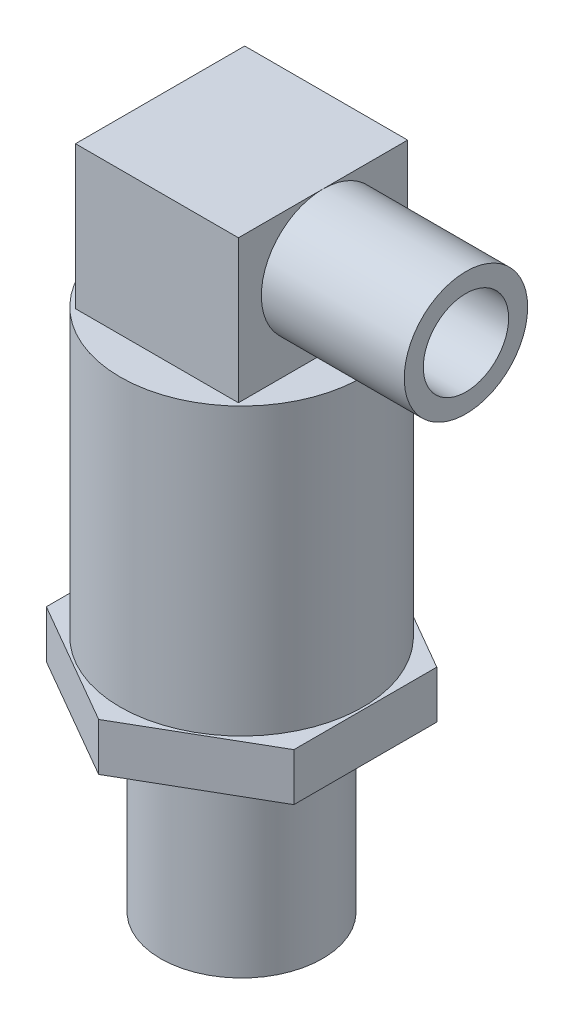
ISO-10303-21;
HEADER;
FILE_DESCRIPTION(('STEP AP214'),'2;1');
FILE_NAME('part.step','',(''),(''),'','','');
FILE_SCHEMA(('AUTOMOTIVE_DESIGN { 1 0 10303 214 1 1 1 1 }'));
ENDSEC;
DATA;
#1=APPLICATION_CONTEXT('core data for automotive mechanical design processes');
#2=APPLICATION_PROTOCOL_DEFINITION('international standard','automotive_design',2000,#1);
#3=PRODUCT_CONTEXT('',#1,'mechanical');
#4=PRODUCT('Part','Part','',(#3));
#5=PRODUCT_RELATED_PRODUCT_CATEGORY('part','',(#4));
#6=PRODUCT_DEFINITION_FORMATION('','',#4);
#7=PRODUCT_DEFINITION_CONTEXT('part definition',#1,'design');
#8=PRODUCT_DEFINITION('design','',#6,#7);
#9=PRODUCT_DEFINITION_SHAPE('','',#8);
#10=(LENGTH_UNIT() NAMED_UNIT(*) SI_UNIT(.MILLI.,.METRE.));
#11=(NAMED_UNIT(*) PLANE_ANGLE_UNIT() SI_UNIT($,.RADIAN.));
#12=(NAMED_UNIT(*) SI_UNIT($,.STERADIAN.) SOLID_ANGLE_UNIT());
#13=UNCERTAINTY_MEASURE_WITH_UNIT(LENGTH_MEASURE(1.E-05),#10,'distance_accuracy_value','');
#14=(GEOMETRIC_REPRESENTATION_CONTEXT(3) GLOBAL_UNCERTAINTY_ASSIGNED_CONTEXT((#13)) GLOBAL_UNIT_ASSIGNED_CONTEXT((#10,
#11,#12)) REPRESENTATION_CONTEXT('',''));
#15=CARTESIAN_POINT('',(0.,0.,0.));
#16=DIRECTION('',(0.,0.,1.));
#17=DIRECTION('',(1.,0.,0.));
#18=AXIS2_PLACEMENT_3D('',#15,#16,#17);
#19=CARTESIAN_POINT('',(0.,-20.,0.));
#20=DIRECTION('',(0.,1.,0.));
#21=DIRECTION('',(0.,0.,1.));
#22=AXIS2_PLACEMENT_3D('',#19,#20,#21);
#23=CYLINDRICAL_SURFACE('',#22,8.5);
#24=CARTESIAN_POINT('',(0.,-20.,0.));
#25=DIRECTION('',(0.,1.,0.));
#26=DIRECTION('',(0.,0.,1.));
#27=AXIS2_PLACEMENT_3D('',#24,#25,#26);
#28=CIRCLE('',#27,8.5);
#29=CARTESIAN_POINT('',(0.,-20.,8.5));
#30=VERTEX_POINT('',#29);
#31=EDGE_CURVE('E48',#30,#30,#28,.T.);
#32=ORIENTED_EDGE('',*,*,#31,.T.);
#33=EDGE_LOOP('',(#32));
#34=FACE_BOUND('',#33,.T.);
#35=CARTESIAN_POINT('',(0.,0.,0.));
#36=DIRECTION('',(0.,1.,0.));
#37=DIRECTION('',(0.,0.,1.));
#38=AXIS2_PLACEMENT_3D('',#35,#36,#37);
#39=CIRCLE('',#38,8.5);
#40=CARTESIAN_POINT('',(0.,0.,8.5));
#41=VERTEX_POINT('',#40);
#42=EDGE_CURVE('E43',#41,#41,#39,.T.);
#43=ORIENTED_EDGE('',*,*,#42,.F.);
#44=EDGE_LOOP('',(#43));
#45=FACE_BOUND('',#44,.T.);
#46=ADVANCED_FACE('F40',(#34,#45),#23,.T.);
#47=CARTESIAN_POINT('',(0.,-20.,0.));
#48=DIRECTION('',(0.,1.,0.));
#49=DIRECTION('',(0.,0.,1.));
#50=AXIS2_PLACEMENT_3D('',#47,#48,#49);
#51=PLANE('',#50);
#52=ORIENTED_EDGE('',*,*,#31,.F.);
#53=EDGE_LOOP('',(#52));
#54=FACE_BOUND('',#53,.T.);
#55=ADVANCED_FACE('F217',(#54),#51,.F.);
#56=CARTESIAN_POINT('',(12.990381056766,5.,-7.50000000000006));
#57=DIRECTION('',(-0.5,0.,0.866025403784439));
#58=DIRECTION('',(0.866025403784439,0.,0.5));
#59=AXIS2_PLACEMENT_3D('',#56,#57,#58);
#60=PLANE('',#59);
#61=DIRECTION('',(-0.866025403784439,0.,-0.5));
#62=VECTOR('',#61,1.);
#63=CARTESIAN_POINT('',(12.990381056766,0.,-7.50000000000006));
#64=LINE('',#63,#62);
#65=CARTESIAN_POINT('',(12.990381056766,0.,-7.50000000000006));
#66=VERTEX_POINT('',#65);
#67=CARTESIAN_POINT('',(0.,0.,-15.0000000000001));
#68=VERTEX_POINT('',#67);
#69=EDGE_CURVE('E163',#66,#68,#64,.T.);
#70=ORIENTED_EDGE('',*,*,#69,.T.);
#71=DIRECTION('',(0.,-1.,0.));
#72=VECTOR('',#71,1.);
#73=CARTESIAN_POINT('',(0.,5.,-15.0000000000001));
#74=LINE('',#73,#72);
#75=CARTESIAN_POINT('',(0.,5.,-15.0000000000001));
#76=VERTEX_POINT('',#75);
#77=EDGE_CURVE('E205',#76,#68,#74,.T.);
#78=ORIENTED_EDGE('',*,*,#77,.F.);
#79=DIRECTION('',(-0.866025403784439,0.,-0.5));
#80=VECTOR('',#79,1.);
#81=CARTESIAN_POINT('',(12.990381056766,5.,-7.50000000000006));
#82=LINE('',#81,#80);
#83=CARTESIAN_POINT('',(12.990381056766,5.,-7.50000000000006));
#84=VERTEX_POINT('',#83);
#85=EDGE_CURVE('E165',#84,#76,#82,.T.);
#86=ORIENTED_EDGE('',*,*,#85,.F.);
#87=DIRECTION('',(0.,-1.,0.));
#88=VECTOR('',#87,1.);
#89=CARTESIAN_POINT('',(12.990381056766,5.,-7.50000000000006));
#90=LINE('',#89,#88);
#91=EDGE_CURVE('E179',#84,#66,#90,.T.);
#92=ORIENTED_EDGE('',*,*,#91,.T.);
#93=EDGE_LOOP('',(#70,#78,#86,#92));
#94=FACE_BOUND('',#93,.T.);
#95=ADVANCED_FACE('F221',(#94),#60,.F.);
#96=CARTESIAN_POINT('',(0.,5.,-15.0000000000001));
#97=DIRECTION('',(0.5,0.,0.866025403784439));
#98=DIRECTION('',(0.866025403784439,0.,-0.5));
#99=AXIS2_PLACEMENT_3D('',#96,#97,#98);
#100=PLANE('',#99);
#101=DIRECTION('',(-0.866025403784439,0.,0.5));
#102=VECTOR('',#101,1.);
#103=CARTESIAN_POINT('',(0.,0.,-15.0000000000001));
#104=LINE('',#103,#102);
#105=CARTESIAN_POINT('',(-12.9903810567678,0.,-7.50000000000006));
#106=VERTEX_POINT('',#105);
#107=EDGE_CURVE('E182',#68,#106,#104,.T.);
#108=ORIENTED_EDGE('',*,*,#107,.T.);
#109=DIRECTION('',(0.,-1.,0.));
#110=VECTOR('',#109,1.);
#111=CARTESIAN_POINT('',(-12.9903810567678,5.,-7.50000000000006));
#112=LINE('',#111,#110);
#113=CARTESIAN_POINT('',(-12.9903810567678,5.,-7.50000000000006));
#114=VERTEX_POINT('',#113);
#115=EDGE_CURVE('E202',#114,#106,#112,.T.);
#116=ORIENTED_EDGE('',*,*,#115,.F.);
#117=DIRECTION('',(-0.866025403784439,0.,0.5));
#118=VECTOR('',#117,1.);
#119=CARTESIAN_POINT('',(0.,5.,-15.0000000000001));
#120=LINE('',#119,#118);
#121=EDGE_CURVE('E168',#76,#114,#120,.T.);
#122=ORIENTED_EDGE('',*,*,#121,.F.);
#123=ORIENTED_EDGE('',*,*,#77,.T.);
#124=EDGE_LOOP('',(#108,#116,#122,#123));
#125=FACE_BOUND('',#124,.T.);
#126=ADVANCED_FACE('F226',(#125),#100,.F.);
#127=CARTESIAN_POINT('',(-12.9903810567678,5.,-7.50000000000006));
#128=DIRECTION('',(1.,0.,0.));
#129=DIRECTION('',(0.,0.,-1.));
#130=AXIS2_PLACEMENT_3D('',#127,#128,#129);
#131=PLANE('',#130);
#132=DIRECTION('',(0.,0.,1.));
#133=VECTOR('',#132,1.);
#134=CARTESIAN_POINT('',(-12.9903810567678,0.,-7.50000000000006));
#135=LINE('',#134,#133);
#136=CARTESIAN_POINT('',(-12.9903810567669,0.,7.49999999999995));
#137=VERTEX_POINT('',#136);
#138=EDGE_CURVE('E184',#106,#137,#135,.T.);
#139=ORIENTED_EDGE('',*,*,#138,.T.);
#140=DIRECTION('',(0.,-1.,0.));
#141=VECTOR('',#140,1.);
#142=CARTESIAN_POINT('',(-12.9903810567669,5.,7.49999999999995));
#143=LINE('',#142,#141);
#144=CARTESIAN_POINT('',(-12.9903810567669,5.,7.49999999999995));
#145=VERTEX_POINT('',#144);
#146=EDGE_CURVE('E199',#145,#137,#143,.T.);
#147=ORIENTED_EDGE('',*,*,#146,.F.);
#148=DIRECTION('',(0.,0.,1.));
#149=VECTOR('',#148,1.);
#150=CARTESIAN_POINT('',(-12.9903810567678,5.,-7.50000000000006));
#151=LINE('',#150,#149);
#152=EDGE_CURVE('E171',#114,#145,#151,.T.);
#153=ORIENTED_EDGE('',*,*,#152,.F.);
#154=ORIENTED_EDGE('',*,*,#115,.T.);
#155=EDGE_LOOP('',(#139,#147,#153,#154));
#156=FACE_BOUND('',#155,.T.);
#157=ADVANCED_FACE('F232',(#156),#131,.F.);
#158=CARTESIAN_POINT('',(-12.9903810567669,5.,7.49999999999995));
#159=DIRECTION('',(0.5,0.,-0.866025403784439));
#160=DIRECTION('',(-0.866025403784439,0.,-0.5));
#161=AXIS2_PLACEMENT_3D('',#158,#159,#160);
#162=PLANE('',#161);
#163=DIRECTION('',(0.866025403784439,0.,0.5));
#164=VECTOR('',#163,1.);
#165=CARTESIAN_POINT('',(-12.9903810567669,0.,7.49999999999995));
#166=LINE('',#165,#164);
#167=CARTESIAN_POINT('',(0.,0.,15.));
#168=VERTEX_POINT('',#167);
#169=EDGE_CURVE('E186',#137,#168,#166,.T.);
#170=ORIENTED_EDGE('',*,*,#169,.T.);
#171=DIRECTION('',(0.,-1.,0.));
#172=VECTOR('',#171,1.);
#173=CARTESIAN_POINT('',(0.,5.,15.));
#174=LINE('',#173,#172);
#175=CARTESIAN_POINT('',(0.,5.,15.));
#176=VERTEX_POINT('',#175);
#177=EDGE_CURVE('E196',#176,#168,#174,.T.);
#178=ORIENTED_EDGE('',*,*,#177,.F.);
#179=DIRECTION('',(0.866025403784439,0.,0.5));
#180=VECTOR('',#179,1.);
#181=CARTESIAN_POINT('',(-12.9903810567669,5.,7.49999999999995));
#182=LINE('',#181,#180);
#183=EDGE_CURVE('E173',#145,#176,#182,.T.);
#184=ORIENTED_EDGE('',*,*,#183,.F.);
#185=ORIENTED_EDGE('',*,*,#146,.T.);
#186=EDGE_LOOP('',(#170,#178,#184,#185));
#187=FACE_BOUND('',#186,.T.);
#188=ADVANCED_FACE('F236',(#187),#162,.F.);
#189=CARTESIAN_POINT('',(0.,5.,15.));
#190=DIRECTION('',(-0.5,0.,-0.866025403784439));
#191=DIRECTION('',(-0.866025403784439,0.,0.5));
#192=AXIS2_PLACEMENT_3D('',#189,#190,#191);
#193=PLANE('',#192);
#194=DIRECTION('',(0.866025403784439,0.,-0.5));
#195=VECTOR('',#194,1.);
#196=CARTESIAN_POINT('',(0.,0.,15.));
#197=LINE('',#196,#195);
#198=CARTESIAN_POINT('',(12.990381056766,0.,7.49999999999995));
#199=VERTEX_POINT('',#198);
#200=EDGE_CURVE('E188',#168,#199,#197,.T.);
#201=ORIENTED_EDGE('',*,*,#200,.T.);
#202=DIRECTION('',(0.,-1.,0.));
#203=VECTOR('',#202,1.);
#204=CARTESIAN_POINT('',(12.990381056766,5.,7.49999999999995));
#205=LINE('',#204,#203);
#206=CARTESIAN_POINT('',(12.990381056766,5.,7.49999999999995));
#207=VERTEX_POINT('',#206);
#208=EDGE_CURVE('E193',#207,#199,#205,.T.);
#209=ORIENTED_EDGE('',*,*,#208,.F.);
#210=DIRECTION('',(0.866025403784439,0.,-0.5));
#211=VECTOR('',#210,1.);
#212=CARTESIAN_POINT('',(0.,5.,15.));
#213=LINE('',#212,#211);
#214=EDGE_CURVE('E175',#176,#207,#213,.T.);
#215=ORIENTED_EDGE('',*,*,#214,.F.);
#216=ORIENTED_EDGE('',*,*,#177,.T.);
#217=EDGE_LOOP('',(#201,#209,#215,#216));
#218=FACE_BOUND('',#217,.T.);
#219=ADVANCED_FACE('F240',(#218),#193,.F.);
#220=CARTESIAN_POINT('',(12.990381056766,5.,7.49999999999995));
#221=DIRECTION('',(-1.,0.,0.));
#222=DIRECTION('',(0.,0.,1.));
#223=AXIS2_PLACEMENT_3D('',#220,#221,#222);
#224=PLANE('',#223);
#225=DIRECTION('',(0.,0.,-1.));
#226=VECTOR('',#225,1.);
#227=CARTESIAN_POINT('',(12.990381056766,0.,7.49999999999995));
#228=LINE('',#227,#226);
#229=EDGE_CURVE('E169',#199,#66,#228,.T.);
#230=ORIENTED_EDGE('',*,*,#229,.T.);
#231=ORIENTED_EDGE('',*,*,#91,.F.);
#232=DIRECTION('',(0.,0.,-1.));
#233=VECTOR('',#232,1.);
#234=CARTESIAN_POINT('',(12.990381056766,5.,7.49999999999995));
#235=LINE('',#234,#233);
#236=EDGE_CURVE('E177',#207,#84,#235,.T.);
#237=ORIENTED_EDGE('',*,*,#236,.F.);
#238=ORIENTED_EDGE('',*,*,#208,.T.);
#239=EDGE_LOOP('',(#230,#231,#237,#238));
#240=FACE_BOUND('',#239,.T.);
#241=ADVANCED_FACE('F244',(#240),#224,.F.);
#242=CARTESIAN_POINT('',(0.,5.,0.));
#243=DIRECTION('',(0.,1.,0.));
#244=DIRECTION('',(0.,0.,1.));
#245=AXIS2_PLACEMENT_3D('',#242,#243,#244);
#246=PLANE('',#245);
#247=CARTESIAN_POINT('',(0.,5.,0.));
#248=DIRECTION('',(0.,1.,0.));
#249=DIRECTION('',(0.,0.,1.));
#250=AXIS2_PLACEMENT_3D('',#247,#248,#249);
#251=CIRCLE('',#250,12.749335579714);
#252=CARTESIAN_POINT('',(0.,5.,12.749335579714));
#253=VERTEX_POINT('',#252);
#254=EDGE_CURVE('E12',#253,#253,#251,.T.);
#255=ORIENTED_EDGE('',*,*,#254,.F.);
#256=EDGE_LOOP('',(#255));
#257=FACE_BOUND('',#256,.T.);
#258=ORIENTED_EDGE('',*,*,#85,.T.);
#259=ORIENTED_EDGE('',*,*,#121,.T.);
#260=ORIENTED_EDGE('',*,*,#152,.T.);
#261=ORIENTED_EDGE('',*,*,#183,.T.);
#262=ORIENTED_EDGE('',*,*,#214,.T.);
#263=ORIENTED_EDGE('',*,*,#236,.T.);
#264=EDGE_LOOP('',(#258,#259,#260,#261,#262,#263));
#265=FACE_BOUND('',#264,.T.);
#266=ADVANCED_FACE('F248',(#257,#265),#246,.T.);
#267=CARTESIAN_POINT('',(0.,0.,0.));
#268=DIRECTION('',(0.,1.,0.));
#269=DIRECTION('',(0.,0.,1.));
#270=AXIS2_PLACEMENT_3D('',#267,#268,#269);
#271=PLANE('',#270);
#272=ORIENTED_EDGE('',*,*,#42,.T.);
#273=EDGE_LOOP('',(#272));
#274=FACE_BOUND('',#273,.T.);
#275=ORIENTED_EDGE('',*,*,#69,.F.);
#276=ORIENTED_EDGE('',*,*,#229,.F.);
#277=ORIENTED_EDGE('',*,*,#200,.F.);
#278=ORIENTED_EDGE('',*,*,#169,.F.);
#279=ORIENTED_EDGE('',*,*,#138,.F.);
#280=ORIENTED_EDGE('',*,*,#107,.F.);
#281=EDGE_LOOP('',(#275,#276,#277,#278,#279,#280));
#282=FACE_BOUND('',#281,.T.);
#283=ADVANCED_FACE('F213',(#274,#282),#271,.F.);
#284=CARTESIAN_POINT('',(0.,35.,0.));
#285=DIRECTION('',(0.,-1.,0.));
#286=DIRECTION('',(0.,0.,-1.));
#287=AXIS2_PLACEMENT_3D('',#284,#285,#286);
#288=CYLINDRICAL_SURFACE('',#287,12.749335579714);
#289=CARTESIAN_POINT('',(0.,35.,0.));
#290=DIRECTION('',(0.,1.,0.));
#291=DIRECTION('',(0.,0.,1.));
#292=AXIS2_PLACEMENT_3D('',#289,#290,#291);
#293=CIRCLE('',#292,12.749335579714);
#294=CARTESIAN_POINT('',(0.,35.,12.749335579714));
#295=VERTEX_POINT('',#294);
#296=EDGE_CURVE('E161',#295,#295,#293,.T.);
#297=ORIENTED_EDGE('',*,*,#296,.F.);
#298=EDGE_LOOP('',(#297));
#299=FACE_BOUND('',#298,.T.);
#300=ORIENTED_EDGE('',*,*,#254,.T.);
#301=EDGE_LOOP('',(#300));
#302=FACE_BOUND('',#301,.T.);
#303=ADVANCED_FACE('F252',(#299,#302),#288,.T.);
#304=CARTESIAN_POINT('',(0.,35.,0.));
#305=DIRECTION('',(0.,1.,0.));
#306=DIRECTION('',(0.,0.,1.));
#307=AXIS2_PLACEMENT_3D('',#304,#305,#306);
#308=PLANE('',#307);
#309=DIRECTION('',(0.,0.,-1.));
#310=VECTOR('',#309,1.);
#311=CARTESIAN_POINT('',(8.55122404156106,35.,8.88138713196995));
#312=LINE('',#311,#310);
#313=CARTESIAN_POINT('',(8.55122404156106,35.,8.88138713196995));
#314=VERTEX_POINT('',#313);
#315=CARTESIAN_POINT('',(8.55122404156106,35.,-8.88138713196995));
#316=VERTEX_POINT('',#315);
#317=EDGE_CURVE('E56',#314,#316,#312,.T.);
#318=ORIENTED_EDGE('',*,*,#317,.F.);
#319=DIRECTION('',(1.,0.,0.));
#320=VECTOR('',#319,1.);
#321=CARTESIAN_POINT('',(-8.55122404156194,35.,8.88138713196984));
#322=LINE('',#321,#320);
#323=CARTESIAN_POINT('',(-8.55122404156194,35.,8.88138713196984));
#324=VERTEX_POINT('',#323);
#325=EDGE_CURVE('E60',#324,#314,#322,.T.);
#326=ORIENTED_EDGE('',*,*,#325,.F.);
#327=DIRECTION('',(0.,0.,1.));
#328=VECTOR('',#327,1.);
#329=CARTESIAN_POINT('',(-8.55122404156194,35.,8.88138713196984));
#330=LINE('',#329,#328);
#331=CARTESIAN_POINT('',(-8.55122404156283,35.,-8.88138713196995));
#332=VERTEX_POINT('',#331);
#333=EDGE_CURVE('E137',#332,#324,#330,.T.);
#334=ORIENTED_EDGE('',*,*,#333,.F.);
#335=DIRECTION('',(-1.,0.,0.));
#336=VECTOR('',#335,1.);
#337=CARTESIAN_POINT('',(-8.55122404156283,35.,-8.88138713196995));
#338=LINE('',#337,#336);
#339=EDGE_CURVE('E148',#316,#332,#338,.T.);
#340=ORIENTED_EDGE('',*,*,#339,.F.);
#341=EDGE_LOOP('',(#318,#326,#334,#340));
#342=FACE_BOUND('',#341,.T.);
#343=ORIENTED_EDGE('',*,*,#296,.T.);
#344=EDGE_LOOP('',(#343));
#345=FACE_BOUND('',#344,.T.);
#346=ADVANCED_FACE('F258',(#342,#345),#308,.T.);
#347=CARTESIAN_POINT('',(8.55122404156106,50.,8.88138713196995));
#348=DIRECTION('',(-1.,0.,0.));
#349=DIRECTION('',(0.,0.,1.));
#350=AXIS2_PLACEMENT_3D('',#347,#348,#349);
#351=PLANE('',#350);
#352=DIRECTION('',(0.,0.,-1.));
#353=VECTOR('',#352,1.);
#354=CARTESIAN_POINT('',(8.55122404156106,50.,8.88138713196995));
#355=LINE('',#354,#353);
#356=CARTESIAN_POINT('',(8.55122404156106,50.,-1.11022302462516E-13));
#357=VERTEX_POINT('',#356);
#358=CARTESIAN_POINT('',(8.55122404156106,50.,-8.88138713196995));
#359=VERTEX_POINT('',#358);
#360=EDGE_CURVE('E121',#357,#359,#355,.T.);
#361=ORIENTED_EDGE('',*,*,#360,.F.);
#362=CARTESIAN_POINT('',(8.55122404156106,43.5226448121711,-1.11022302462516E-13));
#363=DIRECTION('',(1.,0.,0.));
#364=DIRECTION('',(0.,0.,-1.));
#365=AXIS2_PLACEMENT_3D('',#362,#363,#364);
#366=CIRCLE('',#365,6.47735518782887);
#367=EDGE_CURVE('E134',#357,#357,#366,.T.);
#368=ORIENTED_EDGE('',*,*,#367,.F.);
#369=CARTESIAN_POINT('',(8.55122404156106,50.,8.88138713196995));
#370=VERTEX_POINT('',#369);
#371=EDGE_CURVE('E118',#370,#357,#355,.T.);
#372=ORIENTED_EDGE('',*,*,#371,.F.);
#373=DIRECTION('',(0.,-1.,0.));
#374=VECTOR('',#373,1.);
#375=CARTESIAN_POINT('',(8.55122404156106,50.,8.88138713196995));
#376=LINE('',#375,#374);
#377=EDGE_CURVE('E146',#370,#314,#376,.T.);
#378=ORIENTED_EDGE('',*,*,#377,.T.);
#379=ORIENTED_EDGE('',*,*,#317,.T.);
#380=DIRECTION('',(0.,-1.,0.));
#381=VECTOR('',#380,1.);
#382=CARTESIAN_POINT('',(8.55122404156106,50.,-8.88138713196995));
#383=LINE('',#382,#381);
#384=EDGE_CURVE('E136',#359,#316,#383,.T.);
#385=ORIENTED_EDGE('',*,*,#384,.F.);
#386=EDGE_LOOP('',(#361,#368,#372,#378,#379,#385));
#387=FACE_BOUND('',#386,.T.);
#388=ADVANCED_FACE('F132',(#387),#351,.F.);
#389=CARTESIAN_POINT('',(-8.55122404156283,50.,-8.88138713196984));
#390=DIRECTION('',(0.,0.,1.));
#391=DIRECTION('',(1.,0.,0.));
#392=AXIS2_PLACEMENT_3D('',#389,#390,#391);
#393=PLANE('',#392);
#394=ORIENTED_EDGE('',*,*,#339,.T.);
#395=DIRECTION('',(0.,-1.,0.));
#396=VECTOR('',#395,1.);
#397=CARTESIAN_POINT('',(-8.55122404156283,50.,-8.88138713196984));
#398=LINE('',#397,#396);
#399=CARTESIAN_POINT('',(-8.55122404156283,50.,-8.88138713196984));
#400=VERTEX_POINT('',#399);
#401=EDGE_CURVE('E157',#400,#332,#398,.T.);
#402=ORIENTED_EDGE('',*,*,#401,.F.);
#403=DIRECTION('',(-1.,0.,0.));
#404=VECTOR('',#403,1.);
#405=CARTESIAN_POINT('',(-8.55122404156283,50.,-8.88138713196984));
#406=LINE('',#405,#404);
#407=EDGE_CURVE('E129',#359,#400,#406,.T.);
#408=ORIENTED_EDGE('',*,*,#407,.F.);
#409=ORIENTED_EDGE('',*,*,#384,.T.);
#410=EDGE_LOOP('',(#394,#402,#408,#409));
#411=FACE_BOUND('',#410,.T.);
#412=ADVANCED_FACE('F264',(#411),#393,.F.);
#413=CARTESIAN_POINT('',(-8.55122404156194,50.,8.88138713196984));
#414=DIRECTION('',(1.,0.,0.));
#415=DIRECTION('',(0.,0.,-1.));
#416=AXIS2_PLACEMENT_3D('',#413,#414,#415);
#417=PLANE('',#416);
#418=ORIENTED_EDGE('',*,*,#333,.T.);
#419=DIRECTION('',(0.,-1.,0.));
#420=VECTOR('',#419,1.);
#421=CARTESIAN_POINT('',(-8.55122404156194,50.,8.88138713196984));
#422=LINE('',#421,#420);
#423=CARTESIAN_POINT('',(-8.55122404156194,50.,8.88138713196984));
#424=VERTEX_POINT('',#423);
#425=EDGE_CURVE('E154',#424,#324,#422,.T.);
#426=ORIENTED_EDGE('',*,*,#425,.F.);
#427=DIRECTION('',(0.,0.,1.));
#428=VECTOR('',#427,1.);
#429=CARTESIAN_POINT('',(-8.55122404156194,50.,8.88138713196984));
#430=LINE('',#429,#428);
#431=EDGE_CURVE('E143',#400,#424,#430,.T.);
#432=ORIENTED_EDGE('',*,*,#431,.F.);
#433=ORIENTED_EDGE('',*,*,#401,.T.);
#434=EDGE_LOOP('',(#418,#426,#432,#433));
#435=FACE_BOUND('',#434,.T.);
#436=ADVANCED_FACE('F268',(#435),#417,.F.);
#437=CARTESIAN_POINT('',(-8.55122404156194,50.,8.88138713196984));
#438=DIRECTION('',(0.,0.,-1.));
#439=DIRECTION('',(-1.,0.,0.));
#440=AXIS2_PLACEMENT_3D('',#437,#438,#439);
#441=PLANE('',#440);
#442=ORIENTED_EDGE('',*,*,#325,.T.);
#443=ORIENTED_EDGE('',*,*,#377,.F.);
#444=DIRECTION('',(1.,0.,0.));
#445=VECTOR('',#444,1.);
#446=CARTESIAN_POINT('',(-8.55122404156194,50.,8.88138713196984));
#447=LINE('',#446,#445);
#448=EDGE_CURVE('E124',#424,#370,#447,.T.);
#449=ORIENTED_EDGE('',*,*,#448,.F.);
#450=ORIENTED_EDGE('',*,*,#425,.T.);
#451=EDGE_LOOP('',(#442,#443,#449,#450));
#452=FACE_BOUND('',#451,.T.);
#453=ADVANCED_FACE('F272',(#452),#441,.F.);
#454=CARTESIAN_POINT('',(0.,50.,0.));
#455=DIRECTION('',(0.,-1.,0.));
#456=DIRECTION('',(0.,0.,-1.));
#457=AXIS2_PLACEMENT_3D('',#454,#455,#456);
#458=PLANE('',#457);
#459=ORIENTED_EDGE('',*,*,#371,.T.);
#460=ORIENTED_EDGE('',*,*,#360,.T.);
#461=ORIENTED_EDGE('',*,*,#407,.T.);
#462=ORIENTED_EDGE('',*,*,#431,.T.);
#463=ORIENTED_EDGE('',*,*,#448,.T.);
#464=EDGE_LOOP('',(#459,#460,#461,#462,#463));
#465=FACE_BOUND('',#464,.T.);
#466=ADVANCED_FACE('F120',(#465),#458,.F.);
#467=CARTESIAN_POINT('',(23.5512240415616,43.5226448121711,0.));
#468=DIRECTION('',(1.,0.,0.));
#469=DIRECTION('',(0.,0.,-1.));
#470=AXIS2_PLACEMENT_3D('',#467,#468,#469);
#471=PLANE('',#470);
#472=CARTESIAN_POINT('',(23.5512240415616,43.5226448121711,0.));
#473=DIRECTION('',(1.,0.,0.));
#474=DIRECTION('',(0.,0.,-1.));
#475=AXIS2_PLACEMENT_3D('',#472,#473,#474);
#476=CIRCLE('',#475,6.47735518782887);
#477=CARTESIAN_POINT('',(23.5512240415616,43.5226448121711,-6.47735518782887));
#478=VERTEX_POINT('',#477);
#479=EDGE_CURVE('E149',#478,#478,#476,.T.);
#480=ORIENTED_EDGE('',*,*,#479,.T.);
#481=EDGE_LOOP('',(#480));
#482=FACE_BOUND('',#481,.T.);
#483=CARTESIAN_POINT('',(23.5512240415616,43.5226448121711,0.));
#484=DIRECTION('',(1.,0.,0.));
#485=DIRECTION('',(0.,0.,-1.));
#486=AXIS2_PLACEMENT_3D('',#483,#484,#485);
#487=CIRCLE('',#486,4.47735518782887);
#488=CARTESIAN_POINT('',(23.5512240415616,43.5226448121711,-4.47735518782887));
#489=VERTEX_POINT('',#488);
#490=EDGE_CURVE('E297',#489,#489,#487,.T.);
#491=ORIENTED_EDGE('',*,*,#490,.F.);
#492=EDGE_LOOP('',(#491));
#493=FACE_BOUND('',#492,.T.);
#494=ADVANCED_FACE('F279',(#482,#493),#471,.T.);
#495=CARTESIAN_POINT('',(23.5512240415616,43.5226448121711,0.));
#496=DIRECTION('',(-1.,0.,0.));
#497=DIRECTION('',(0.,0.,1.));
#498=AXIS2_PLACEMENT_3D('',#495,#496,#497);
#499=CYLINDRICAL_SURFACE('',#498,6.47735518782887);
#500=ORIENTED_EDGE('',*,*,#479,.F.);
#501=EDGE_LOOP('',(#500));
#502=FACE_BOUND('',#501,.T.);
#503=ORIENTED_EDGE('',*,*,#367,.T.);
#504=EDGE_LOOP('',(#503));
#505=FACE_BOUND('',#504,.T.);
#506=ADVANCED_FACE('F280',(#502,#505),#499,.T.);
#507=CARTESIAN_POINT('',(23.5512240415616,43.5226448121711,0.));
#508=DIRECTION('',(-1.,0.,0.));
#509=DIRECTION('',(0.,0.,1.));
#510=AXIS2_PLACEMENT_3D('',#507,#508,#509);
#511=CYLINDRICAL_SURFACE('',#510,4.47735518782887);
#512=ORIENTED_EDGE('',*,*,#490,.T.);
#513=EDGE_LOOP('',(#512));
#514=FACE_BOUND('',#513,.T.);
#515=CARTESIAN_POINT('',(8.55122404156106,43.5226448121711,-1.11022302462516E-13));
#516=DIRECTION('',(1.,0.,0.));
#517=DIRECTION('',(0.,0.,-1.));
#518=AXIS2_PLACEMENT_3D('',#515,#516,#517);
#519=CIRCLE('',#518,4.47735518782887);
#520=CARTESIAN_POINT('',(8.55122404156106,43.5226448121711,-4.47735518782898));
#521=VERTEX_POINT('',#520);
#522=EDGE_CURVE('E300',#521,#521,#519,.T.);
#523=ORIENTED_EDGE('',*,*,#522,.F.);
#524=EDGE_LOOP('',(#523));
#525=FACE_BOUND('',#524,.T.);
#526=ADVANCED_FACE('F283',(#514,#525),#511,.F.);
#527=ORIENTED_EDGE('',*,*,#522,.T.);
#528=EDGE_LOOP('',(#527));
#529=FACE_BOUND('',#528,.T.);
#530=ADVANCED_FACE('F265',(#529),#351,.F.);
#531=CLOSED_SHELL('',(#46,#55,#95,#126,#157,#188,#219,#241,#266,#283,#303,#346,#388,#412,#436,
#453,#466,#494,#506,#526,#530));
#532=MANIFOLD_SOLID_BREP('B2',#531);
#533=ADVANCED_BREP_SHAPE_REPRESENTATION('',(#18,#532),#14);
#534=SHAPE_DEFINITION_REPRESENTATION(#9,#533);
ENDSEC;
END-ISO-10303-21;
